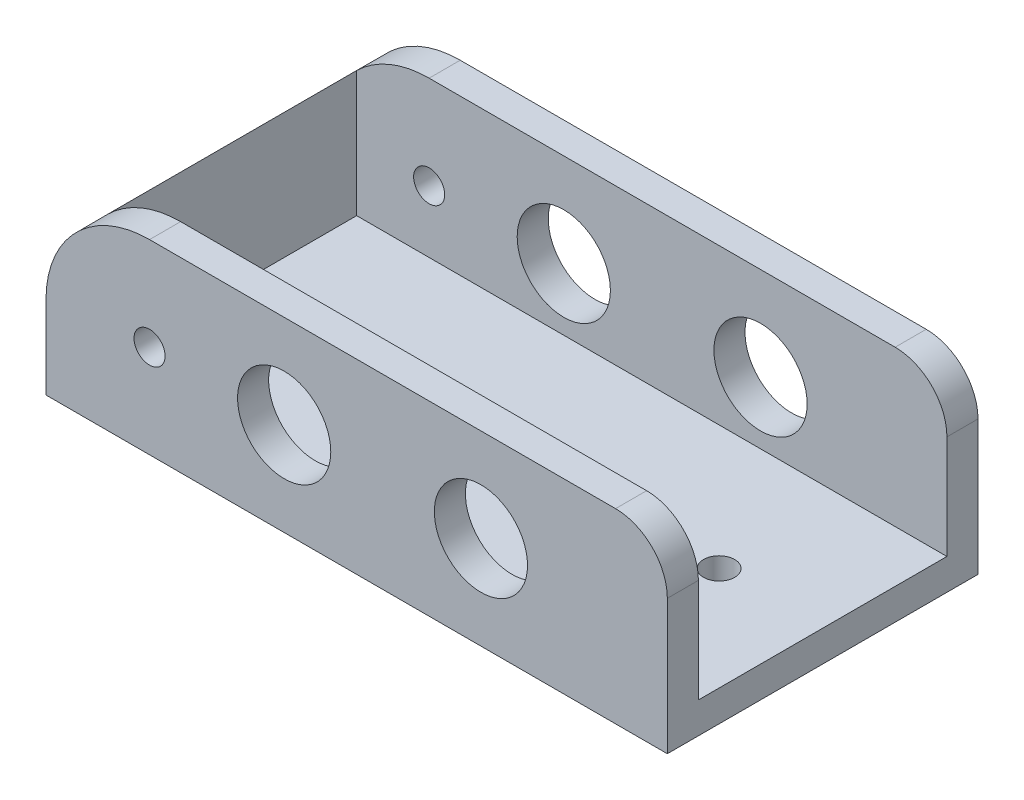
ISO-10303-21;
HEADER;
FILE_DESCRIPTION(('STEP AP214'),'2;1');
FILE_NAME('part.step','',(''),(''),'','','');
FILE_SCHEMA(('AUTOMOTIVE_DESIGN { 1 0 10303 214 1 1 1 1 }'));
ENDSEC;
DATA;
#1=APPLICATION_CONTEXT('core data for automotive mechanical design processes');
#2=APPLICATION_PROTOCOL_DEFINITION('international standard','automotive_design',2000,#1);
#3=PRODUCT_CONTEXT('',#1,'mechanical');
#4=PRODUCT('Part','Part','',(#3));
#5=PRODUCT_RELATED_PRODUCT_CATEGORY('part','',(#4));
#6=PRODUCT_DEFINITION_FORMATION('','',#4);
#7=PRODUCT_DEFINITION_CONTEXT('part definition',#1,'design');
#8=PRODUCT_DEFINITION('design','',#6,#7);
#9=PRODUCT_DEFINITION_SHAPE('','',#8);
#10=(LENGTH_UNIT() NAMED_UNIT(*) SI_UNIT(.MILLI.,.METRE.));
#11=(NAMED_UNIT(*) PLANE_ANGLE_UNIT() SI_UNIT($,.RADIAN.));
#12=(NAMED_UNIT(*) SI_UNIT($,.STERADIAN.) SOLID_ANGLE_UNIT());
#13=UNCERTAINTY_MEASURE_WITH_UNIT(LENGTH_MEASURE(1.E-05),#10,'distance_accuracy_value','');
#14=(GEOMETRIC_REPRESENTATION_CONTEXT(3) GLOBAL_UNCERTAINTY_ASSIGNED_CONTEXT((#13)) GLOBAL_UNIT_ASSIGNED_CONTEXT((#10,
#11,#12)) REPRESENTATION_CONTEXT('',''));
#15=CARTESIAN_POINT('',(0.,0.,0.));
#16=DIRECTION('',(0.,0.,1.));
#17=DIRECTION('',(1.,0.,0.));
#18=AXIS2_PLACEMENT_3D('',#15,#16,#17);
#19=CARTESIAN_POINT('',(0.,18.,0.));
#20=DIRECTION('',(0.,1.,0.));
#21=DIRECTION('',(0.,0.,1.));
#22=AXIS2_PLACEMENT_3D('',#19,#20,#21);
#23=PLANE('',#22);
#24=DIRECTION('',(1.,0.,0.));
#25=VECTOR('',#24,1.);
#26=CARTESIAN_POINT('',(3.,18.,-27.));
#27=LINE('',#26,#25);
#28=CARTESIAN_POINT('',(10.,18.,-27.));
#29=VERTEX_POINT('',#28);
#30=CARTESIAN_POINT('',(55.,18.,-27.));
#31=VERTEX_POINT('',#30);
#32=EDGE_CURVE('E260',#29,#31,#27,.T.);
#33=ORIENTED_EDGE('',*,*,#32,.T.);
#34=DIRECTION('',(0.,0.,-1.));
#35=VECTOR('',#34,1.);
#36=CARTESIAN_POINT('',(55.,18.,-30.));
#37=LINE('',#36,#35);
#38=CARTESIAN_POINT('',(55.,18.,-30.));
#39=VERTEX_POINT('',#38);
#40=EDGE_CURVE('E219',#31,#39,#37,.T.);
#41=ORIENTED_EDGE('',*,*,#40,.T.);
#42=DIRECTION('',(-1.,0.,0.));
#43=VECTOR('',#42,1.);
#44=CARTESIAN_POINT('',(0.,18.,-30.));
#45=LINE('',#44,#43);
#46=CARTESIAN_POINT('',(10.,18.,-30.));
#47=VERTEX_POINT('',#46);
#48=EDGE_CURVE('E159',#39,#47,#45,.T.);
#49=ORIENTED_EDGE('',*,*,#48,.T.);
#50=DIRECTION('',(0.,0.,1.));
#51=VECTOR('',#50,1.);
#52=CARTESIAN_POINT('',(10.,18.,0.));
#53=LINE('',#52,#51);
#54=EDGE_CURVE('E204',#47,#29,#53,.T.);
#55=ORIENTED_EDGE('',*,*,#54,.T.);
#56=EDGE_LOOP('',(#33,#41,#49,#55));
#57=FACE_BOUND('',#56,.T.);
#58=ADVANCED_FACE('F35',(#57),#23,.T.);
#59=CARTESIAN_POINT('',(0.,3.,0.));
#60=DIRECTION('',(0.,-1.,0.));
#61=DIRECTION('',(0.,0.,-1.));
#62=AXIS2_PLACEMENT_3D('',#59,#60,#61);
#63=PLANE('',#62);
#64=CARTESIAN_POINT('',(50.,3.,-15.));
#65=DIRECTION('',(0.,1.,0.));
#66=DIRECTION('',(0.,0.,1.));
#67=AXIS2_PLACEMENT_3D('',#64,#65,#66);
#68=CIRCLE('',#67,1.5);
#69=CARTESIAN_POINT('',(50.,3.,-13.5));
#70=VERTEX_POINT('',#69);
#71=EDGE_CURVE('E169',#70,#70,#68,.T.);
#72=ORIENTED_EDGE('',*,*,#71,.F.);
#73=EDGE_LOOP('',(#72));
#74=FACE_BOUND('',#73,.T.);
#75=CARTESIAN_POINT('',(10.,3.,-15.));
#76=DIRECTION('',(0.,1.,0.));
#77=DIRECTION('',(0.,0.,1.));
#78=AXIS2_PLACEMENT_3D('',#75,#76,#77);
#79=CIRCLE('',#78,1.5);
#80=CARTESIAN_POINT('',(10.,3.,-13.5));
#81=VERTEX_POINT('',#80);
#82=EDGE_CURVE('E175',#81,#81,#79,.T.);
#83=ORIENTED_EDGE('',*,*,#82,.F.);
#84=EDGE_LOOP('',(#83));
#85=FACE_BOUND('',#84,.T.);
#86=DIRECTION('',(1.,0.,0.));
#87=VECTOR('',#86,1.);
#88=CARTESIAN_POINT('',(3.,3.,-27.));
#89=LINE('',#88,#87);
#90=CARTESIAN_POINT('',(3.,3.,-27.));
#91=VERTEX_POINT('',#90);
#92=CARTESIAN_POINT('',(60.,3.,-27.));
#93=VERTEX_POINT('',#92);
#94=EDGE_CURVE('E148',#91,#93,#89,.T.);
#95=ORIENTED_EDGE('',*,*,#94,.F.);
#96=DIRECTION('',(0.,0.,-1.));
#97=VECTOR('',#96,1.);
#98=CARTESIAN_POINT('',(3.,3.,-27.));
#99=LINE('',#98,#97);
#100=CARTESIAN_POINT('',(3.,3.,-3.));
#101=VERTEX_POINT('',#100);
#102=EDGE_CURVE('E130',#101,#91,#99,.T.);
#103=ORIENTED_EDGE('',*,*,#102,.F.);
#104=DIRECTION('',(-1.,0.,0.));
#105=VECTOR('',#104,1.);
#106=CARTESIAN_POINT('',(3.,3.,-3.));
#107=LINE('',#106,#105);
#108=CARTESIAN_POINT('',(60.,3.,-3.));
#109=VERTEX_POINT('',#108);
#110=EDGE_CURVE('E145',#109,#101,#107,.T.);
#111=ORIENTED_EDGE('',*,*,#110,.F.);
#112=DIRECTION('',(0.,0.,-1.));
#113=VECTOR('',#112,1.);
#114=CARTESIAN_POINT('',(60.,3.,0.));
#115=LINE('',#114,#113);
#116=EDGE_CURVE('E181',#109,#93,#115,.T.);
#117=ORIENTED_EDGE('',*,*,#116,.T.);
#118=EDGE_LOOP('',(#95,#103,#111,#117));
#119=FACE_BOUND('',#118,.T.);
#120=ADVANCED_FACE('F143',(#74,#85,#119),#63,.F.);
#121=CARTESIAN_POINT('',(0.,0.,0.));
#122=DIRECTION('',(0.,-1.,0.));
#123=DIRECTION('',(0.,0.,-1.));
#124=AXIS2_PLACEMENT_3D('',#121,#122,#123);
#125=PLANE('',#124);
#126=CARTESIAN_POINT('',(10.,0.,-15.));
#127=DIRECTION('',(0.,1.,0.));
#128=DIRECTION('',(0.,0.,1.));
#129=AXIS2_PLACEMENT_3D('',#126,#127,#128);
#130=CIRCLE('',#129,1.5);
#131=CARTESIAN_POINT('',(10.,0.,-13.5));
#132=VERTEX_POINT('',#131);
#133=EDGE_CURVE('E172',#132,#132,#130,.T.);
#134=ORIENTED_EDGE('',*,*,#133,.T.);
#135=EDGE_LOOP('',(#134));
#136=FACE_BOUND('',#135,.T.);
#137=DIRECTION('',(0.,0.,1.));
#138=VECTOR('',#137,1.);
#139=CARTESIAN_POINT('',(0.,0.,0.));
#140=LINE('',#139,#138);
#141=CARTESIAN_POINT('',(0.,0.,-30.));
#142=VERTEX_POINT('',#141);
#143=CARTESIAN_POINT('',(0.,0.,0.));
#144=VERTEX_POINT('',#143);
#145=EDGE_CURVE('E178',#142,#144,#140,.T.);
#146=ORIENTED_EDGE('',*,*,#145,.F.);
#147=DIRECTION('',(-1.,0.,0.));
#148=VECTOR('',#147,1.);
#149=CARTESIAN_POINT('',(0.,0.,-30.));
#150=LINE('',#149,#148);
#151=CARTESIAN_POINT('',(60.,0.,-30.));
#152=VERTEX_POINT('',#151);
#153=EDGE_CURVE('E184',#152,#142,#150,.T.);
#154=ORIENTED_EDGE('',*,*,#153,.F.);
#155=DIRECTION('',(0.,0.,-1.));
#156=VECTOR('',#155,1.);
#157=CARTESIAN_POINT('',(60.,0.,0.));
#158=LINE('',#157,#156);
#159=CARTESIAN_POINT('',(60.,0.,0.));
#160=VERTEX_POINT('',#159);
#161=EDGE_CURVE('E190',#160,#152,#158,.T.);
#162=ORIENTED_EDGE('',*,*,#161,.F.);
#163=DIRECTION('',(1.,0.,0.));
#164=VECTOR('',#163,1.);
#165=CARTESIAN_POINT('',(0.,0.,0.));
#166=LINE('',#165,#164);
#167=EDGE_CURVE('E187',#144,#160,#166,.T.);
#168=ORIENTED_EDGE('',*,*,#167,.F.);
#169=EDGE_LOOP('',(#146,#154,#162,#168));
#170=FACE_BOUND('',#169,.T.);
#171=CARTESIAN_POINT('',(50.,0.,-15.));
#172=DIRECTION('',(0.,1.,0.));
#173=DIRECTION('',(0.,0.,1.));
#174=AXIS2_PLACEMENT_3D('',#171,#172,#173);
#175=CIRCLE('',#174,1.5);
#176=CARTESIAN_POINT('',(50.,0.,-13.5));
#177=VERTEX_POINT('',#176);
#178=EDGE_CURVE('E168',#177,#177,#175,.T.);
#179=ORIENTED_EDGE('',*,*,#178,.T.);
#180=EDGE_LOOP('',(#179));
#181=FACE_BOUND('',#180,.T.);
#182=ADVANCED_FACE('F289',(#136,#170,#181),#125,.T.);
#183=CARTESIAN_POINT('',(0.,3.,0.));
#184=DIRECTION('',(1.,0.,0.));
#185=DIRECTION('',(0.,0.,-1.));
#186=AXIS2_PLACEMENT_3D('',#183,#184,#185);
#187=PLANE('',#186);
#188=DIRECTION('',(0.,-1.,0.));
#189=VECTOR('',#188,1.);
#190=CARTESIAN_POINT('',(0.,3.,0.));
#191=LINE('',#190,#189);
#192=CARTESIAN_POINT('',(0.,8.,0.));
#193=VERTEX_POINT('',#192);
#194=EDGE_CURVE('E200',#193,#144,#191,.T.);
#195=ORIENTED_EDGE('',*,*,#194,.F.);
#196=DIRECTION('',(0.,0.,1.));
#197=VECTOR('',#196,1.);
#198=CARTESIAN_POINT('',(0.,8.,-30.));
#199=LINE('',#198,#197);
#200=CARTESIAN_POINT('',(0.,8.,-30.));
#201=VERTEX_POINT('',#200);
#202=EDGE_CURVE('E214',#193,#201,#199,.F.);
#203=ORIENTED_EDGE('',*,*,#202,.T.);
#204=DIRECTION('',(0.,-1.,0.));
#205=VECTOR('',#204,1.);
#206=CARTESIAN_POINT('',(0.,3.,-30.));
#207=LINE('',#206,#205);
#208=EDGE_CURVE('E183',#201,#142,#207,.T.);
#209=ORIENTED_EDGE('',*,*,#208,.T.);
#210=ORIENTED_EDGE('',*,*,#145,.T.);
#211=EDGE_LOOP('',(#195,#203,#209,#210));
#212=FACE_BOUND('',#211,.T.);
#213=ADVANCED_FACE('F293',(#212),#187,.F.);
#214=CARTESIAN_POINT('',(0.,3.,0.));
#215=DIRECTION('',(0.,0.,-1.));
#216=DIRECTION('',(-1.,0.,0.));
#217=AXIS2_PLACEMENT_3D('',#214,#215,#216);
#218=PLANE('',#217);
#219=CARTESIAN_POINT('',(42.,9.,0.));
#220=DIRECTION('',(0.,0.,1.));
#221=DIRECTION('',(1.,0.,0.));
#222=AXIS2_PLACEMENT_3D('',#219,#220,#221);
#223=CIRCLE('',#222,4.5);
#224=CARTESIAN_POINT('',(46.5,9.,0.));
#225=VERTEX_POINT('',#224);
#226=EDGE_CURVE('E236',#225,#225,#223,.T.);
#227=ORIENTED_EDGE('',*,*,#226,.F.);
#228=EDGE_LOOP('',(#227));
#229=FACE_BOUND('',#228,.T.);
#230=CARTESIAN_POINT('',(23.,8.99999999999999,0.));
#231=DIRECTION('',(0.,0.,1.));
#232=DIRECTION('',(1.,0.,0.));
#233=AXIS2_PLACEMENT_3D('',#230,#231,#232);
#234=CIRCLE('',#233,4.5);
#235=CARTESIAN_POINT('',(27.5,8.99999999999999,0.));
#236=VERTEX_POINT('',#235);
#237=EDGE_CURVE('E482',#236,#236,#234,.T.);
#238=ORIENTED_EDGE('',*,*,#237,.F.);
#239=EDGE_LOOP('',(#238));
#240=FACE_BOUND('',#239,.T.);
#241=CARTESIAN_POINT('',(9.99999999999997,9.,0.));
#242=DIRECTION('',(0.,0.,1.));
#243=DIRECTION('',(1.,0.,0.));
#244=AXIS2_PLACEMENT_3D('',#241,#242,#243);
#245=CIRCLE('',#244,1.5);
#246=CARTESIAN_POINT('',(11.5,9.,0.));
#247=VERTEX_POINT('',#246);
#248=EDGE_CURVE('E485',#247,#247,#245,.T.);
#249=ORIENTED_EDGE('',*,*,#248,.F.);
#250=EDGE_LOOP('',(#249));
#251=FACE_BOUND('',#250,.T.);
#252=DIRECTION('',(0.,-1.,0.));
#253=VECTOR('',#252,1.);
#254=CARTESIAN_POINT('',(60.,3.,0.));
#255=LINE('',#254,#253);
#256=CARTESIAN_POINT('',(60.,13.,0.));
#257=VERTEX_POINT('',#256);
#258=EDGE_CURVE('E198',#257,#160,#255,.T.);
#259=ORIENTED_EDGE('',*,*,#258,.F.);
#260=CARTESIAN_POINT('',(55.,13.,0.));
#261=DIRECTION('',(0.,0.,-1.));
#262=DIRECTION('',(-1.,0.,0.));
#263=AXIS2_PLACEMENT_3D('',#260,#261,#262);
#264=CIRCLE('',#263,5.);
#265=CARTESIAN_POINT('',(55.,18.,0.));
#266=VERTEX_POINT('',#265);
#267=EDGE_CURVE('E11',#257,#266,#264,.F.);
#268=ORIENTED_EDGE('',*,*,#267,.T.);
#269=DIRECTION('',(1.,0.,0.));
#270=VECTOR('',#269,1.);
#271=CARTESIAN_POINT('',(0.,18.,0.));
#272=LINE('',#271,#270);
#273=CARTESIAN_POINT('',(10.,18.,0.));
#274=VERTEX_POINT('',#273);
#275=EDGE_CURVE('E163',#274,#266,#272,.T.);
#276=ORIENTED_EDGE('',*,*,#275,.F.);
#277=CARTESIAN_POINT('',(10.,8.,0.));
#278=DIRECTION('',(0.,0.,-1.));
#279=DIRECTION('',(-1.,0.,0.));
#280=AXIS2_PLACEMENT_3D('',#277,#278,#279);
#281=CIRCLE('',#280,10.);
#282=EDGE_CURVE('E212',#274,#193,#281,.F.);
#283=ORIENTED_EDGE('',*,*,#282,.T.);
#284=ORIENTED_EDGE('',*,*,#194,.T.);
#285=ORIENTED_EDGE('',*,*,#167,.T.);
#286=EDGE_LOOP('',(#259,#268,#276,#283,#284,#285));
#287=FACE_BOUND('',#286,.T.);
#288=ADVANCED_FACE('F296',(#229,#240,#251,#287),#218,.F.);
#289=CARTESIAN_POINT('',(60.,3.,0.));
#290=DIRECTION('',(-1.,0.,0.));
#291=DIRECTION('',(0.,0.,1.));
#292=AXIS2_PLACEMENT_3D('',#289,#290,#291);
#293=PLANE('',#292);
#294=DIRECTION('',(0.,-1.,0.));
#295=VECTOR('',#294,1.);
#296=CARTESIAN_POINT('',(60.,3.,-30.));
#297=LINE('',#296,#295);
#298=CARTESIAN_POINT('',(60.,13.,-30.));
#299=VERTEX_POINT('',#298);
#300=EDGE_CURVE('E196',#299,#152,#297,.T.);
#301=ORIENTED_EDGE('',*,*,#300,.F.);
#302=DIRECTION('',(0.,0.,-1.));
#303=VECTOR('',#302,1.);
#304=CARTESIAN_POINT('',(60.,13.,-27.));
#305=LINE('',#304,#303);
#306=CARTESIAN_POINT('',(60.,13.,-27.));
#307=VERTEX_POINT('',#306);
#308=EDGE_CURVE('E226',#299,#307,#305,.F.);
#309=ORIENTED_EDGE('',*,*,#308,.T.);
#310=DIRECTION('',(0.,-1.,0.));
#311=VECTOR('',#310,1.);
#312=CARTESIAN_POINT('',(60.,18.,-27.));
#313=LINE('',#312,#311);
#314=EDGE_CURVE('E164',#307,#93,#313,.T.);
#315=ORIENTED_EDGE('',*,*,#314,.T.);
#316=ORIENTED_EDGE('',*,*,#116,.F.);
#317=DIRECTION('',(0.,-1.,0.));
#318=VECTOR('',#317,1.);
#319=CARTESIAN_POINT('',(60.,18.,-3.));
#320=LINE('',#319,#318);
#321=CARTESIAN_POINT('',(60.,13.,-3.));
#322=VERTEX_POINT('',#321);
#323=EDGE_CURVE('E137',#322,#109,#320,.T.);
#324=ORIENTED_EDGE('',*,*,#323,.F.);
#325=DIRECTION('',(0.,0.,-1.));
#326=VECTOR('',#325,1.);
#327=CARTESIAN_POINT('',(60.,13.,0.));
#328=LINE('',#327,#326);
#329=EDGE_CURVE('E224',#322,#257,#328,.F.);
#330=ORIENTED_EDGE('',*,*,#329,.T.);
#331=ORIENTED_EDGE('',*,*,#258,.T.);
#332=ORIENTED_EDGE('',*,*,#161,.T.);
#333=EDGE_LOOP('',(#301,#309,#315,#316,#324,#330,#331,#332));
#334=FACE_BOUND('',#333,.T.);
#335=ADVANCED_FACE('F283',(#334),#293,.F.);
#336=CARTESIAN_POINT('',(0.,3.,-30.));
#337=DIRECTION('',(0.,0.,1.));
#338=DIRECTION('',(1.,0.,0.));
#339=AXIS2_PLACEMENT_3D('',#336,#337,#338);
#340=PLANE('',#339);
#341=CARTESIAN_POINT('',(42.,9.,-30.));
#342=DIRECTION('',(0.,0.,1.));
#343=DIRECTION('',(1.,0.,0.));
#344=AXIS2_PLACEMENT_3D('',#341,#342,#343);
#345=CIRCLE('',#344,4.5);
#346=CARTESIAN_POINT('',(46.5,9.,-30.));
#347=VERTEX_POINT('',#346);
#348=EDGE_CURVE('E153',#347,#347,#345,.T.);
#349=ORIENTED_EDGE('',*,*,#348,.T.);
#350=EDGE_LOOP('',(#349));
#351=FACE_BOUND('',#350,.T.);
#352=CARTESIAN_POINT('',(23.,8.99999999999999,-30.));
#353=DIRECTION('',(0.,0.,1.));
#354=DIRECTION('',(1.,0.,0.));
#355=AXIS2_PLACEMENT_3D('',#352,#353,#354);
#356=CIRCLE('',#355,4.5);
#357=CARTESIAN_POINT('',(27.5,8.99999999999999,-30.));
#358=VERTEX_POINT('',#357);
#359=EDGE_CURVE('E244',#358,#358,#356,.T.);
#360=ORIENTED_EDGE('',*,*,#359,.T.);
#361=EDGE_LOOP('',(#360));
#362=FACE_BOUND('',#361,.T.);
#363=CARTESIAN_POINT('',(9.99999999999997,9.,-30.));
#364=DIRECTION('',(0.,0.,1.));
#365=DIRECTION('',(1.,0.,0.));
#366=AXIS2_PLACEMENT_3D('',#363,#364,#365);
#367=CIRCLE('',#366,1.5);
#368=CARTESIAN_POINT('',(11.5,9.,-30.));
#369=VERTEX_POINT('',#368);
#370=EDGE_CURVE('E240',#369,#369,#367,.T.);
#371=ORIENTED_EDGE('',*,*,#370,.T.);
#372=EDGE_LOOP('',(#371));
#373=FACE_BOUND('',#372,.T.);
#374=ORIENTED_EDGE('',*,*,#48,.F.);
#375=CARTESIAN_POINT('',(55.,13.,-30.));
#376=DIRECTION('',(0.,0.,1.));
#377=DIRECTION('',(1.,0.,0.));
#378=AXIS2_PLACEMENT_3D('',#375,#376,#377);
#379=CIRCLE('',#378,5.);
#380=EDGE_CURVE('E222',#39,#299,#379,.F.);
#381=ORIENTED_EDGE('',*,*,#380,.T.);
#382=ORIENTED_EDGE('',*,*,#300,.T.);
#383=ORIENTED_EDGE('',*,*,#153,.T.);
#384=ORIENTED_EDGE('',*,*,#208,.F.);
#385=CARTESIAN_POINT('',(10.,8.,-30.));
#386=DIRECTION('',(0.,0.,1.));
#387=DIRECTION('',(1.,0.,0.));
#388=AXIS2_PLACEMENT_3D('',#385,#386,#387);
#389=CIRCLE('',#388,10.);
#390=EDGE_CURVE('E216',#201,#47,#389,.F.);
#391=ORIENTED_EDGE('',*,*,#390,.T.);
#392=EDGE_LOOP('',(#374,#381,#382,#383,#384,#391));
#393=FACE_BOUND('',#392,.T.);
#394=ADVANCED_FACE('F270',(#351,#362,#373,#393),#340,.F.);
#395=CARTESIAN_POINT('',(10.,3.,-15.));
#396=DIRECTION('',(0.,-1.,0.));
#397=DIRECTION('',(0.,0.,-1.));
#398=AXIS2_PLACEMENT_3D('',#395,#396,#397);
#399=CYLINDRICAL_SURFACE('',#398,1.5);
#400=ORIENTED_EDGE('',*,*,#82,.T.);
#401=EDGE_LOOP('',(#400));
#402=FACE_BOUND('',#401,.T.);
#403=ORIENTED_EDGE('',*,*,#133,.F.);
#404=EDGE_LOOP('',(#403));
#405=FACE_BOUND('',#404,.T.);
#406=ADVANCED_FACE('F336',(#402,#405),#399,.F.);
#407=CARTESIAN_POINT('',(50.,3.,-15.));
#408=DIRECTION('',(0.,-1.,0.));
#409=DIRECTION('',(0.,0.,-1.));
#410=AXIS2_PLACEMENT_3D('',#407,#408,#409);
#411=CYLINDRICAL_SURFACE('',#410,1.5);
#412=ORIENTED_EDGE('',*,*,#71,.T.);
#413=EDGE_LOOP('',(#412));
#414=FACE_BOUND('',#413,.T.);
#415=ORIENTED_EDGE('',*,*,#178,.F.);
#416=EDGE_LOOP('',(#415));
#417=FACE_BOUND('',#416,.T.);
#418=ADVANCED_FACE('F332',(#414,#417),#411,.F.);
#419=CARTESIAN_POINT('',(3.,18.,-3.));
#420=DIRECTION('',(0.,0.,1.));
#421=DIRECTION('',(1.,0.,0.));
#422=AXIS2_PLACEMENT_3D('',#419,#420,#421);
#423=PLANE('',#422);
#424=CARTESIAN_POINT('',(42.,9.,-3.));
#425=DIRECTION('',(0.,0.,1.));
#426=DIRECTION('',(1.,0.,0.));
#427=AXIS2_PLACEMENT_3D('',#424,#425,#426);
#428=CIRCLE('',#427,4.5);
#429=CARTESIAN_POINT('',(46.5,9.,-3.));
#430=VERTEX_POINT('',#429);
#431=EDGE_CURVE('E156',#430,#430,#428,.T.);
#432=ORIENTED_EDGE('',*,*,#431,.T.);
#433=EDGE_LOOP('',(#432));
#434=FACE_BOUND('',#433,.T.);
#435=CARTESIAN_POINT('',(23.,8.99999999999999,-3.));
#436=DIRECTION('',(0.,0.,1.));
#437=DIRECTION('',(1.,0.,0.));
#438=AXIS2_PLACEMENT_3D('',#435,#436,#437);
#439=CIRCLE('',#438,4.5);
#440=CARTESIAN_POINT('',(27.5,8.99999999999999,-3.));
#441=VERTEX_POINT('',#440);
#442=EDGE_CURVE('E239',#441,#441,#439,.T.);
#443=ORIENTED_EDGE('',*,*,#442,.T.);
#444=EDGE_LOOP('',(#443));
#445=FACE_BOUND('',#444,.T.);
#446=CARTESIAN_POINT('',(9.99999999999997,9.,-3.));
#447=DIRECTION('',(0.,0.,1.));
#448=DIRECTION('',(1.,0.,0.));
#449=AXIS2_PLACEMENT_3D('',#446,#447,#448);
#450=CIRCLE('',#449,1.5);
#451=CARTESIAN_POINT('',(11.5,9.,-3.));
#452=VERTEX_POINT('',#451);
#453=EDGE_CURVE('E235',#452,#452,#450,.T.);
#454=ORIENTED_EDGE('',*,*,#453,.T.);
#455=EDGE_LOOP('',(#454));
#456=FACE_BOUND('',#455,.T.);
#457=DIRECTION('',(-1.,0.,0.));
#458=VECTOR('',#457,1.);
#459=CARTESIAN_POINT('',(3.,18.,-3.));
#460=LINE('',#459,#458);
#461=CARTESIAN_POINT('',(55.,18.,-3.));
#462=VERTEX_POINT('',#461);
#463=CARTESIAN_POINT('',(10.,18.,-3.));
#464=VERTEX_POINT('',#463);
#465=EDGE_CURVE('E259',#462,#464,#460,.T.);
#466=ORIENTED_EDGE('',*,*,#465,.F.);
#467=CARTESIAN_POINT('',(55.,13.,-3.));
#468=DIRECTION('',(0.,0.,1.));
#469=DIRECTION('',(1.,0.,0.));
#470=AXIS2_PLACEMENT_3D('',#467,#468,#469);
#471=CIRCLE('',#470,5.);
#472=EDGE_CURVE('E44',#462,#322,#471,.F.);
#473=ORIENTED_EDGE('',*,*,#472,.T.);
#474=ORIENTED_EDGE('',*,*,#323,.T.);
#475=ORIENTED_EDGE('',*,*,#110,.T.);
#476=DIRECTION('',(0.,-1.,0.));
#477=VECTOR('',#476,1.);
#478=CARTESIAN_POINT('',(3.,18.,-3.));
#479=LINE('',#478,#477);
#480=CARTESIAN_POINT('',(3.,15.1414284285429,-3.));
#481=VERTEX_POINT('',#480);
#482=EDGE_CURVE('E126',#481,#101,#479,.T.);
#483=ORIENTED_EDGE('',*,*,#482,.F.);
#484=CARTESIAN_POINT('',(10.,8.,-3.));
#485=DIRECTION('',(0.,0.,1.));
#486=DIRECTION('',(1.,0.,0.));
#487=AXIS2_PLACEMENT_3D('',#484,#485,#486);
#488=CIRCLE('',#487,10.);
#489=EDGE_CURVE('E210',#481,#464,#488,.F.);
#490=ORIENTED_EDGE('',*,*,#489,.T.);
#491=EDGE_LOOP('',(#466,#473,#474,#475,#483,#490));
#492=FACE_BOUND('',#491,.T.);
#493=ADVANCED_FACE('F151',(#434,#445,#456,#492),#423,.F.);
#494=CARTESIAN_POINT('',(3.,18.,-27.));
#495=DIRECTION('',(-1.,0.,0.));
#496=DIRECTION('',(0.,0.,1.));
#497=AXIS2_PLACEMENT_3D('',#494,#495,#496);
#498=PLANE('',#497);
#499=DIRECTION('',(0.,-1.,0.));
#500=VECTOR('',#499,1.);
#501=CARTESIAN_POINT('',(3.,18.,-27.));
#502=LINE('',#501,#500);
#503=CARTESIAN_POINT('',(3.,15.1414284285428,-27.));
#504=VERTEX_POINT('',#503);
#505=EDGE_CURVE('E138',#504,#91,#502,.T.);
#506=ORIENTED_EDGE('',*,*,#505,.F.);
#507=DIRECTION('',(0.,0.,-1.));
#508=VECTOR('',#507,1.);
#509=CARTESIAN_POINT('',(3.,15.1414284285428,-27.));
#510=LINE('',#509,#508);
#511=EDGE_CURVE('E132',#504,#481,#510,.F.);
#512=ORIENTED_EDGE('',*,*,#511,.T.);
#513=ORIENTED_EDGE('',*,*,#482,.T.);
#514=ORIENTED_EDGE('',*,*,#102,.T.);
#515=EDGE_LOOP('',(#506,#512,#513,#514));
#516=FACE_BOUND('',#515,.T.);
#517=ADVANCED_FACE('F129',(#516),#498,.F.);
#518=CARTESIAN_POINT('',(3.,18.,-27.));
#519=DIRECTION('',(0.,0.,-1.));
#520=DIRECTION('',(-1.,0.,0.));
#521=AXIS2_PLACEMENT_3D('',#518,#519,#520);
#522=PLANE('',#521);
#523=CARTESIAN_POINT('',(42.,9.,-27.));
#524=DIRECTION('',(0.,0.,-1.));
#525=DIRECTION('',(-1.,0.,0.));
#526=AXIS2_PLACEMENT_3D('',#523,#524,#525);
#527=CIRCLE('',#526,4.5);
#528=CARTESIAN_POINT('',(37.5,9.,-27.));
#529=VERTEX_POINT('',#528);
#530=EDGE_CURVE('E39',#529,#529,#527,.T.);
#531=ORIENTED_EDGE('',*,*,#530,.T.);
#532=EDGE_LOOP('',(#531));
#533=FACE_BOUND('',#532,.T.);
#534=CARTESIAN_POINT('',(23.,8.99999999999999,-27.));
#535=DIRECTION('',(0.,0.,-1.));
#536=DIRECTION('',(-1.,0.,0.));
#537=AXIS2_PLACEMENT_3D('',#534,#535,#536);
#538=CIRCLE('',#537,4.5);
#539=CARTESIAN_POINT('',(18.5,8.99999999999999,-27.));
#540=VERTEX_POINT('',#539);
#541=EDGE_CURVE('E237',#540,#540,#538,.T.);
#542=ORIENTED_EDGE('',*,*,#541,.T.);
#543=EDGE_LOOP('',(#542));
#544=FACE_BOUND('',#543,.T.);
#545=CARTESIAN_POINT('',(9.99999999999997,9.,-27.));
#546=DIRECTION('',(0.,0.,-1.));
#547=DIRECTION('',(-1.,0.,0.));
#548=AXIS2_PLACEMENT_3D('',#545,#546,#547);
#549=CIRCLE('',#548,1.5);
#550=CARTESIAN_POINT('',(8.49999999999997,9.,-27.));
#551=VERTEX_POINT('',#550);
#552=EDGE_CURVE('E233',#551,#551,#549,.T.);
#553=ORIENTED_EDGE('',*,*,#552,.T.);
#554=EDGE_LOOP('',(#553));
#555=FACE_BOUND('',#554,.T.);
#556=ORIENTED_EDGE('',*,*,#314,.F.);
#557=CARTESIAN_POINT('',(55.,13.,-27.));
#558=DIRECTION('',(0.,0.,-1.));
#559=DIRECTION('',(-1.,0.,0.));
#560=AXIS2_PLACEMENT_3D('',#557,#558,#559);
#561=CIRCLE('',#560,5.);
#562=EDGE_CURVE('E228',#307,#31,#561,.F.);
#563=ORIENTED_EDGE('',*,*,#562,.T.);
#564=ORIENTED_EDGE('',*,*,#32,.F.);
#565=CARTESIAN_POINT('',(10.,8.,-27.));
#566=DIRECTION('',(0.,0.,-1.));
#567=DIRECTION('',(-1.,0.,0.));
#568=AXIS2_PLACEMENT_3D('',#565,#566,#567);
#569=CIRCLE('',#568,10.);
#570=EDGE_CURVE('E207',#29,#504,#569,.F.);
#571=ORIENTED_EDGE('',*,*,#570,.T.);
#572=ORIENTED_EDGE('',*,*,#505,.T.);
#573=ORIENTED_EDGE('',*,*,#94,.T.);
#574=EDGE_LOOP('',(#556,#563,#564,#571,#572,#573));
#575=FACE_BOUND('',#574,.T.);
#576=ADVANCED_FACE('F276',(#533,#544,#555,#575),#522,.F.);
#577=ORIENTED_EDGE('',*,*,#275,.T.);
#578=DIRECTION('',(0.,0.,-1.));
#579=VECTOR('',#578,1.);
#580=CARTESIAN_POINT('',(55.,18.,-3.));
#581=LINE('',#580,#579);
#582=EDGE_CURVE('E230',#266,#462,#581,.T.);
#583=ORIENTED_EDGE('',*,*,#582,.T.);
#584=ORIENTED_EDGE('',*,*,#465,.T.);
#585=DIRECTION('',(0.,0.,1.));
#586=VECTOR('',#585,1.);
#587=CARTESIAN_POINT('',(10.,18.,0.));
#588=LINE('',#587,#586);
#589=EDGE_CURVE('E202',#464,#274,#588,.T.);
#590=ORIENTED_EDGE('',*,*,#589,.T.);
#591=EDGE_LOOP('',(#577,#583,#584,#590));
#592=FACE_BOUND('',#591,.T.);
#593=ADVANCED_FACE('F298',(#592),#23,.T.);
#594=CARTESIAN_POINT('',(10.,8.,0.));
#595=DIRECTION('',(0.,0.,-1.));
#596=DIRECTION('',(-1.,0.,0.));
#597=AXIS2_PLACEMENT_3D('',#594,#595,#596);
#598=CYLINDRICAL_SURFACE('',#597,10.);
#599=ORIENTED_EDGE('',*,*,#390,.F.);
#600=ORIENTED_EDGE('',*,*,#202,.F.);
#601=ORIENTED_EDGE('',*,*,#282,.F.);
#602=ORIENTED_EDGE('',*,*,#589,.F.);
#603=ORIENTED_EDGE('',*,*,#489,.F.);
#604=ORIENTED_EDGE('',*,*,#511,.F.);
#605=ORIENTED_EDGE('',*,*,#570,.F.);
#606=ORIENTED_EDGE('',*,*,#54,.F.);
#607=EDGE_LOOP('',(#599,#600,#601,#602,#603,#604,#605,#606));
#608=FACE_BOUND('',#607,.T.);
#609=ADVANCED_FACE('F273',(#608),#598,.T.);
#610=CARTESIAN_POINT('',(55.,13.,0.));
#611=DIRECTION('',(0.,0.,1.));
#612=DIRECTION('',(1.,0.,0.));
#613=AXIS2_PLACEMENT_3D('',#610,#611,#612);
#614=CYLINDRICAL_SURFACE('',#613,5.);
#615=ORIENTED_EDGE('',*,*,#562,.F.);
#616=ORIENTED_EDGE('',*,*,#308,.F.);
#617=ORIENTED_EDGE('',*,*,#380,.F.);
#618=ORIENTED_EDGE('',*,*,#40,.F.);
#619=EDGE_LOOP('',(#615,#616,#617,#618));
#620=FACE_BOUND('',#619,.T.);
#621=ADVANCED_FACE('F280',(#620),#614,.T.);
#622=CARTESIAN_POINT('',(55.,13.,0.));
#623=DIRECTION('',(0.,0.,1.));
#624=DIRECTION('',(1.,0.,0.));
#625=AXIS2_PLACEMENT_3D('',#622,#623,#624);
#626=CYLINDRICAL_SURFACE('',#625,5.);
#627=ORIENTED_EDGE('',*,*,#267,.F.);
#628=ORIENTED_EDGE('',*,*,#329,.F.);
#629=ORIENTED_EDGE('',*,*,#472,.F.);
#630=ORIENTED_EDGE('',*,*,#582,.F.);
#631=EDGE_LOOP('',(#627,#628,#629,#630));
#632=FACE_BOUND('',#631,.T.);
#633=ADVANCED_FACE('F37',(#632),#626,.T.);
#634=CARTESIAN_POINT('',(9.99999999999997,9.,-36.));
#635=DIRECTION('',(0.,0.,1.));
#636=DIRECTION('',(1.,0.,0.));
#637=AXIS2_PLACEMENT_3D('',#634,#635,#636);
#638=CYLINDRICAL_SURFACE('',#637,1.5);
#639=ORIENTED_EDGE('',*,*,#552,.F.);
#640=EDGE_LOOP('',(#639));
#641=FACE_BOUND('',#640,.T.);
#642=ORIENTED_EDGE('',*,*,#370,.F.);
#643=EDGE_LOOP('',(#642));
#644=FACE_BOUND('',#643,.T.);
#645=ADVANCED_FACE('F300',(#641,#644),#638,.F.);
#646=CARTESIAN_POINT('',(23.,8.99999999999999,-36.));
#647=DIRECTION('',(0.,0.,1.));
#648=DIRECTION('',(1.,0.,0.));
#649=AXIS2_PLACEMENT_3D('',#646,#647,#648);
#650=CYLINDRICAL_SURFACE('',#649,4.5);
#651=ORIENTED_EDGE('',*,*,#541,.F.);
#652=EDGE_LOOP('',(#651));
#653=FACE_BOUND('',#652,.T.);
#654=ORIENTED_EDGE('',*,*,#359,.F.);
#655=EDGE_LOOP('',(#654));
#656=FACE_BOUND('',#655,.T.);
#657=ADVANCED_FACE('F305',(#653,#656),#650,.F.);
#658=CARTESIAN_POINT('',(42.,9.,-36.));
#659=DIRECTION('',(0.,0.,1.));
#660=DIRECTION('',(1.,0.,0.));
#661=AXIS2_PLACEMENT_3D('',#658,#659,#660);
#662=CYLINDRICAL_SURFACE('',#661,4.5);
#663=ORIENTED_EDGE('',*,*,#530,.F.);
#664=EDGE_LOOP('',(#663));
#665=FACE_BOUND('',#664,.T.);
#666=ORIENTED_EDGE('',*,*,#348,.F.);
#667=EDGE_LOOP('',(#666));
#668=FACE_BOUND('',#667,.T.);
#669=ADVANCED_FACE('F432',(#665,#668),#662,.F.);
#670=ORIENTED_EDGE('',*,*,#248,.T.);
#671=EDGE_LOOP('',(#670));
#672=FACE_BOUND('',#671,.T.);
#673=ORIENTED_EDGE('',*,*,#453,.F.);
#674=EDGE_LOOP('',(#673));
#675=FACE_BOUND('',#674,.T.);
#676=ADVANCED_FACE('F308',(#672,#675),#638,.F.);
#677=ORIENTED_EDGE('',*,*,#237,.T.);
#678=EDGE_LOOP('',(#677));
#679=FACE_BOUND('',#678,.T.);
#680=ORIENTED_EDGE('',*,*,#442,.F.);
#681=EDGE_LOOP('',(#680));
#682=FACE_BOUND('',#681,.T.);
#683=ADVANCED_FACE('F435',(#679,#682),#650,.F.);
#684=ORIENTED_EDGE('',*,*,#226,.T.);
#685=EDGE_LOOP('',(#684));
#686=FACE_BOUND('',#685,.T.);
#687=ORIENTED_EDGE('',*,*,#431,.F.);
#688=EDGE_LOOP('',(#687));
#689=FACE_BOUND('',#688,.T.);
#690=ADVANCED_FACE('F444',(#686,#689),#662,.F.);
#691=CLOSED_SHELL('',(#58,#120,#182,#213,#288,#335,#394,#406,#418,#493,#517,#576,#593,#609,#621,
#633,#645,#657,#669,#676,#683,#690));
#692=MANIFOLD_SOLID_BREP('B2',#691);
#693=ADVANCED_BREP_SHAPE_REPRESENTATION('',(#18,#692),#14);
#694=SHAPE_DEFINITION_REPRESENTATION(#9,#693);
ENDSEC;
END-ISO-10303-21;
